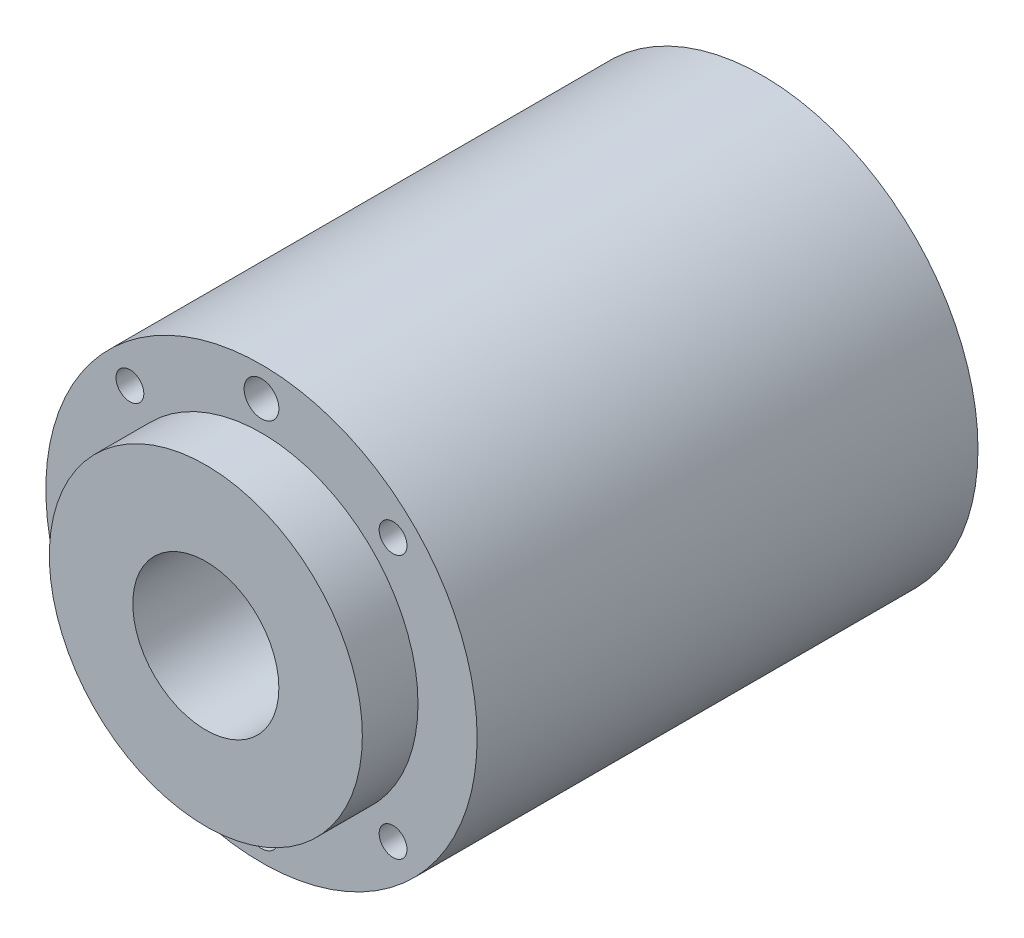
ISO-10303-21;
HEADER;
FILE_DESCRIPTION(('STEP AP214'),'2;1');
FILE_NAME('part.step','',(''),(''),'','','');
FILE_SCHEMA(('AUTOMOTIVE_DESIGN { 1 0 10303 214 1 1 1 1 }'));
ENDSEC;
DATA;
#1=APPLICATION_CONTEXT('core data for automotive mechanical design processes');
#2=APPLICATION_PROTOCOL_DEFINITION('international standard','automotive_design',2000,#1);
#3=PRODUCT_CONTEXT('',#1,'mechanical');
#4=PRODUCT('Part','Part','',(#3));
#5=PRODUCT_RELATED_PRODUCT_CATEGORY('part','',(#4));
#6=PRODUCT_DEFINITION_FORMATION('','',#4);
#7=PRODUCT_DEFINITION_CONTEXT('part definition',#1,'design');
#8=PRODUCT_DEFINITION('design','',#6,#7);
#9=PRODUCT_DEFINITION_SHAPE('','',#8);
#10=(LENGTH_UNIT() NAMED_UNIT(*) SI_UNIT(.MILLI.,.METRE.));
#11=(NAMED_UNIT(*) PLANE_ANGLE_UNIT() SI_UNIT($,.RADIAN.));
#12=(NAMED_UNIT(*) SI_UNIT($,.STERADIAN.) SOLID_ANGLE_UNIT());
#13=UNCERTAINTY_MEASURE_WITH_UNIT(LENGTH_MEASURE(1.E-05),#10,'distance_accuracy_value','');
#14=(GEOMETRIC_REPRESENTATION_CONTEXT(3) GLOBAL_UNCERTAINTY_ASSIGNED_CONTEXT((#13)) GLOBAL_UNIT_ASSIGNED_CONTEXT((#10,
#11,#12)) REPRESENTATION_CONTEXT('',''));
#15=CARTESIAN_POINT('',(0.,0.,0.));
#16=DIRECTION('',(0.,0.,1.));
#17=DIRECTION('',(1.,0.,0.));
#18=AXIS2_PLACEMENT_3D('',#15,#16,#17);
#19=CARTESIAN_POINT('',(0.,0.,-72.));
#20=DIRECTION('',(0.,0.,1.));
#21=DIRECTION('',(1.,0.,0.));
#22=AXIS2_PLACEMENT_3D('',#19,#20,#21);
#23=CYLINDRICAL_SURFACE('',#22,31.);
#24=CARTESIAN_POINT('',(0.,0.,-72.));
#25=DIRECTION('',(0.,0.,1.));
#26=DIRECTION('',(1.,0.,0.));
#27=AXIS2_PLACEMENT_3D('',#24,#25,#26);
#28=CIRCLE('',#27,31.);
#29=CARTESIAN_POINT('',(31.,0.,-72.));
#30=VERTEX_POINT('',#29);
#31=EDGE_CURVE('E48',#30,#30,#28,.T.);
#32=ORIENTED_EDGE('',*,*,#31,.T.);
#33=EDGE_LOOP('',(#32));
#34=FACE_BOUND('',#33,.T.);
#35=CARTESIAN_POINT('',(0.,0.,0.));
#36=DIRECTION('',(0.,0.,1.));
#37=DIRECTION('',(1.,0.,0.));
#38=AXIS2_PLACEMENT_3D('',#35,#36,#37);
#39=CIRCLE('',#38,31.);
#40=CARTESIAN_POINT('',(31.,0.,0.));
#41=VERTEX_POINT('',#40);
#42=EDGE_CURVE('E39',#41,#41,#39,.T.);
#43=ORIENTED_EDGE('',*,*,#42,.F.);
#44=EDGE_LOOP('',(#43));
#45=FACE_BOUND('',#44,.T.);
#46=ADVANCED_FACE('F36',(#34,#45),#23,.T.);
#47=CARTESIAN_POINT('',(0.,0.,-72.));
#48=DIRECTION('',(0.,0.,1.));
#49=DIRECTION('',(1.,0.,0.));
#50=AXIS2_PLACEMENT_3D('',#47,#48,#49);
#51=CYLINDRICAL_SURFACE('',#50,10.5);
#52=CARTESIAN_POINT('',(0.,0.,-72.));
#53=DIRECTION('',(0.,0.,1.));
#54=DIRECTION('',(1.,0.,0.));
#55=AXIS2_PLACEMENT_3D('',#52,#53,#54);
#56=CIRCLE('',#55,10.5);
#57=CARTESIAN_POINT('',(10.5,0.,-72.));
#58=VERTEX_POINT('',#57);
#59=EDGE_CURVE('E43',#58,#58,#56,.T.);
#60=ORIENTED_EDGE('',*,*,#59,.F.);
#61=EDGE_LOOP('',(#60));
#62=FACE_BOUND('',#61,.T.);
#63=CARTESIAN_POINT('',(0.,0.,8.));
#64=DIRECTION('',(0.,0.,1.));
#65=DIRECTION('',(1.,0.,0.));
#66=AXIS2_PLACEMENT_3D('',#63,#64,#65);
#67=CIRCLE('',#66,10.5);
#68=CARTESIAN_POINT('',(10.5,0.,8.));
#69=VERTEX_POINT('',#68);
#70=EDGE_CURVE('E60',#69,#69,#67,.T.);
#71=ORIENTED_EDGE('',*,*,#70,.T.);
#72=EDGE_LOOP('',(#71));
#73=FACE_BOUND('',#72,.T.);
#74=ADVANCED_FACE('F141',(#62,#73),#51,.F.);
#75=CARTESIAN_POINT('',(0.,0.,-72.));
#76=DIRECTION('',(0.,0.,1.));
#77=DIRECTION('',(1.,0.,0.));
#78=AXIS2_PLACEMENT_3D('',#75,#76,#77);
#79=PLANE('',#78);
#80=ORIENTED_EDGE('',*,*,#31,.F.);
#81=EDGE_LOOP('',(#80));
#82=FACE_BOUND('',#81,.T.);
#83=ORIENTED_EDGE('',*,*,#59,.T.);
#84=EDGE_LOOP('',(#83));
#85=FACE_BOUND('',#84,.T.);
#86=ADVANCED_FACE('F110',(#82,#85),#79,.F.);
#87=CARTESIAN_POINT('',(0.,0.,0.));
#88=DIRECTION('',(0.,0.,1.));
#89=DIRECTION('',(1.,0.,0.));
#90=AXIS2_PLACEMENT_3D('',#87,#88,#89);
#91=PLANE('',#90);
#92=CARTESIAN_POINT('',(0.,26.75,0.));
#93=DIRECTION('',(0.,0.,1.));
#94=DIRECTION('',(1.,0.,0.));
#95=AXIS2_PLACEMENT_3D('',#92,#93,#94);
#96=CIRCLE('',#95,2.5);
#97=CARTESIAN_POINT('',(2.5,26.75,0.));
#98=VERTEX_POINT('',#97);
#99=EDGE_CURVE('E68',#98,#98,#96,.T.);
#100=ORIENTED_EDGE('',*,*,#99,.F.);
#101=EDGE_LOOP('',(#100));
#102=FACE_BOUND('',#101,.T.);
#103=CARTESIAN_POINT('',(-18.9151063967401,18.9151063967402,0.));
#104=DIRECTION('',(0.,0.,1.));
#105=DIRECTION('',(1.,0.,0.));
#106=AXIS2_PLACEMENT_3D('',#103,#104,#105);
#107=CIRCLE('',#106,2.00000000000001);
#108=CARTESIAN_POINT('',(-16.91510639674,18.9151063967402,0.));
#109=VERTEX_POINT('',#108);
#110=EDGE_CURVE('E96',#109,#109,#107,.T.);
#111=ORIENTED_EDGE('',*,*,#110,.F.);
#112=EDGE_LOOP('',(#111));
#113=FACE_BOUND('',#112,.T.);
#114=CARTESIAN_POINT('',(18.9151063967402,18.91510639674,0.));
#115=DIRECTION('',(0.,0.,1.));
#116=DIRECTION('',(1.,0.,0.));
#117=AXIS2_PLACEMENT_3D('',#114,#115,#116);
#118=CIRCLE('',#117,2.00000000000001);
#119=CARTESIAN_POINT('',(20.9151063967402,18.91510639674,0.));
#120=VERTEX_POINT('',#119);
#121=EDGE_CURVE('E78',#120,#120,#118,.T.);
#122=ORIENTED_EDGE('',*,*,#121,.F.);
#123=EDGE_LOOP('',(#122));
#124=FACE_BOUND('',#123,.T.);
#125=CARTESIAN_POINT('',(0.,-26.75,0.));
#126=DIRECTION('',(0.,0.,1.));
#127=DIRECTION('',(-1.,0.,0.));
#128=AXIS2_PLACEMENT_3D('',#125,#126,#127);
#129=CIRCLE('',#128,2.5);
#130=CARTESIAN_POINT('',(-2.5,-26.75,0.));
#131=VERTEX_POINT('',#130);
#132=EDGE_CURVE('E71',#131,#131,#129,.T.);
#133=ORIENTED_EDGE('',*,*,#132,.F.);
#134=EDGE_LOOP('',(#133));
#135=FACE_BOUND('',#134,.T.);
#136=CARTESIAN_POINT('',(18.9151063967401,-18.9151063967402,0.));
#137=DIRECTION('',(0.,0.,1.));
#138=DIRECTION('',(1.,0.,0.));
#139=AXIS2_PLACEMENT_3D('',#136,#137,#138);
#140=CIRCLE('',#139,2.00000000000001);
#141=CARTESIAN_POINT('',(20.9151063967401,-18.9151063967402,0.));
#142=VERTEX_POINT('',#141);
#143=EDGE_CURVE('E91',#142,#142,#140,.T.);
#144=ORIENTED_EDGE('',*,*,#143,.F.);
#145=EDGE_LOOP('',(#144));
#146=FACE_BOUND('',#145,.T.);
#147=CARTESIAN_POINT('',(-18.9151063967402,-18.9151063967401,0.));
#148=DIRECTION('',(0.,0.,1.));
#149=DIRECTION('',(1.,0.,0.));
#150=AXIS2_PLACEMENT_3D('',#147,#148,#149);
#151=CIRCLE('',#150,2.00000000000001);
#152=CARTESIAN_POINT('',(-16.9151063967402,-18.9151063967401,0.));
#153=VERTEX_POINT('',#152);
#154=EDGE_CURVE('E84',#153,#153,#151,.T.);
#155=ORIENTED_EDGE('',*,*,#154,.F.);
#156=EDGE_LOOP('',(#155));
#157=FACE_BOUND('',#156,.T.);
#158=CARTESIAN_POINT('',(0.,0.,0.));
#159=DIRECTION('',(0.,0.,1.));
#160=DIRECTION('',(1.,0.,0.));
#161=AXIS2_PLACEMENT_3D('',#158,#159,#160);
#162=CIRCLE('',#161,22.5);
#163=CARTESIAN_POINT('',(22.5,0.,0.));
#164=VERTEX_POINT('',#163);
#165=EDGE_CURVE('E10',#164,#164,#162,.T.);
#166=ORIENTED_EDGE('',*,*,#165,.F.);
#167=EDGE_LOOP('',(#166));
#168=FACE_BOUND('',#167,.T.);
#169=ORIENTED_EDGE('',*,*,#42,.T.);
#170=EDGE_LOOP('',(#169));
#171=FACE_BOUND('',#170,.T.);
#172=ADVANCED_FACE('F106',(#102,#113,#124,#135,#146,#157,#168,#171),#91,.T.);
#173=CARTESIAN_POINT('',(0.,0.,8.));
#174=DIRECTION('',(0.,0.,-1.));
#175=DIRECTION('',(-1.,0.,0.));
#176=AXIS2_PLACEMENT_3D('',#173,#174,#175);
#177=CYLINDRICAL_SURFACE('',#176,22.5);
#178=CARTESIAN_POINT('',(0.,0.,8.));
#179=DIRECTION('',(0.,0.,1.));
#180=DIRECTION('',(1.,0.,0.));
#181=AXIS2_PLACEMENT_3D('',#178,#179,#180);
#182=CIRCLE('',#181,22.5);
#183=CARTESIAN_POINT('',(22.5,0.,8.));
#184=VERTEX_POINT('',#183);
#185=EDGE_CURVE('E51',#184,#184,#182,.T.);
#186=ORIENTED_EDGE('',*,*,#185,.F.);
#187=EDGE_LOOP('',(#186));
#188=FACE_BOUND('',#187,.T.);
#189=ORIENTED_EDGE('',*,*,#165,.T.);
#190=EDGE_LOOP('',(#189));
#191=FACE_BOUND('',#190,.T.);
#192=ADVANCED_FACE('F109',(#188,#191),#177,.T.);
#193=CARTESIAN_POINT('',(0.,0.,8.));
#194=DIRECTION('',(0.,0.,1.));
#195=DIRECTION('',(1.,0.,0.));
#196=AXIS2_PLACEMENT_3D('',#193,#194,#195);
#197=PLANE('',#196);
#198=ORIENTED_EDGE('',*,*,#70,.F.);
#199=EDGE_LOOP('',(#198));
#200=FACE_BOUND('',#199,.T.);
#201=ORIENTED_EDGE('',*,*,#185,.T.);
#202=EDGE_LOOP('',(#201));
#203=FACE_BOUND('',#202,.T.);
#204=ADVANCED_FACE('F126',(#200,#203),#197,.T.);
#205=CARTESIAN_POINT('',(-18.9151063967402,-18.9151063967401,-7.));
#206=DIRECTION('',(0.,0.,1.));
#207=DIRECTION('',(1.,0.,0.));
#208=AXIS2_PLACEMENT_3D('',#205,#206,#207);
#209=CYLINDRICAL_SURFACE('',#208,2.00000000000001);
#210=CARTESIAN_POINT('',(-18.9151063967402,-18.9151063967401,-7.));
#211=DIRECTION('',(0.,0.,1.));
#212=DIRECTION('',(1.,0.,0.));
#213=AXIS2_PLACEMENT_3D('',#210,#211,#212);
#214=CIRCLE('',#213,2.00000000000001);
#215=CARTESIAN_POINT('',(-16.9151063967402,-18.9151063967401,-7.));
#216=VERTEX_POINT('',#215);
#217=EDGE_CURVE('E87',#216,#216,#214,.T.);
#218=ORIENTED_EDGE('',*,*,#217,.F.);
#219=EDGE_LOOP('',(#218));
#220=FACE_BOUND('',#219,.T.);
#221=ORIENTED_EDGE('',*,*,#154,.T.);
#222=EDGE_LOOP('',(#221));
#223=FACE_BOUND('',#222,.T.);
#224=ADVANCED_FACE('F123',(#220,#223),#209,.F.);
#225=CARTESIAN_POINT('',(-18.9151063967402,-18.9151063967401,-7.));
#226=DIRECTION('',(0.,0.,1.));
#227=DIRECTION('',(1.,0.,0.));
#228=AXIS2_PLACEMENT_3D('',#225,#226,#227);
#229=PLANE('',#228);
#230=ORIENTED_EDGE('',*,*,#217,.T.);
#231=EDGE_LOOP('',(#230));
#232=FACE_BOUND('',#231,.T.);
#233=ADVANCED_FACE('F125',(#232),#229,.T.);
#234=CARTESIAN_POINT('',(18.9151063967401,-18.9151063967402,-7.));
#235=DIRECTION('',(0.,0.,1.));
#236=DIRECTION('',(1.,0.,0.));
#237=AXIS2_PLACEMENT_3D('',#234,#235,#236);
#238=CYLINDRICAL_SURFACE('',#237,2.00000000000001);
#239=CARTESIAN_POINT('',(18.9151063967401,-18.9151063967402,-7.));
#240=DIRECTION('',(0.,0.,1.));
#241=DIRECTION('',(1.,0.,0.));
#242=AXIS2_PLACEMENT_3D('',#239,#240,#241);
#243=CIRCLE('',#242,2.00000000000001);
#244=CARTESIAN_POINT('',(20.9151063967401,-18.9151063967402,-7.));
#245=VERTEX_POINT('',#244);
#246=EDGE_CURVE('E75',#245,#245,#243,.T.);
#247=ORIENTED_EDGE('',*,*,#246,.F.);
#248=EDGE_LOOP('',(#247));
#249=FACE_BOUND('',#248,.T.);
#250=ORIENTED_EDGE('',*,*,#143,.T.);
#251=EDGE_LOOP('',(#250));
#252=FACE_BOUND('',#251,.T.);
#253=ADVANCED_FACE('F133',(#249,#252),#238,.F.);
#254=CARTESIAN_POINT('',(18.9151063967401,-18.9151063967402,-7.));
#255=DIRECTION('',(0.,0.,1.));
#256=DIRECTION('',(1.,0.,0.));
#257=AXIS2_PLACEMENT_3D('',#254,#255,#256);
#258=PLANE('',#257);
#259=ORIENTED_EDGE('',*,*,#246,.T.);
#260=EDGE_LOOP('',(#259));
#261=FACE_BOUND('',#260,.T.);
#262=ADVANCED_FACE('F161',(#261),#258,.T.);
#263=CARTESIAN_POINT('',(0.,-26.75,-7.));
#264=DIRECTION('',(0.,0.,1.));
#265=DIRECTION('',(1.,0.,0.));
#266=AXIS2_PLACEMENT_3D('',#263,#264,#265);
#267=CYLINDRICAL_SURFACE('',#266,2.5);
#268=CARTESIAN_POINT('',(0.,-26.75,-7.));
#269=DIRECTION('',(0.,0.,1.));
#270=DIRECTION('',(-1.,0.,0.));
#271=AXIS2_PLACEMENT_3D('',#268,#269,#270);
#272=CIRCLE('',#271,2.5);
#273=CARTESIAN_POINT('',(-2.5,-26.75,-7.));
#274=VERTEX_POINT('',#273);
#275=EDGE_CURVE('E74',#274,#274,#272,.T.);
#276=ORIENTED_EDGE('',*,*,#275,.F.);
#277=EDGE_LOOP('',(#276));
#278=FACE_BOUND('',#277,.T.);
#279=ORIENTED_EDGE('',*,*,#132,.T.);
#280=EDGE_LOOP('',(#279));
#281=FACE_BOUND('',#280,.T.);
#282=ADVANCED_FACE('F157',(#278,#281),#267,.F.);
#283=CARTESIAN_POINT('',(0.,-26.75,-7.));
#284=DIRECTION('',(0.,0.,-1.));
#285=DIRECTION('',(-1.,0.,0.));
#286=AXIS2_PLACEMENT_3D('',#283,#284,#285);
#287=PLANE('',#286);
#288=ORIENTED_EDGE('',*,*,#275,.T.);
#289=EDGE_LOOP('',(#288));
#290=FACE_BOUND('',#289,.T.);
#291=ADVANCED_FACE('F160',(#290),#287,.F.);
#292=CARTESIAN_POINT('',(18.9151063967402,18.91510639674,-7.));
#293=DIRECTION('',(0.,0.,1.));
#294=DIRECTION('',(1.,0.,0.));
#295=AXIS2_PLACEMENT_3D('',#292,#293,#294);
#296=CYLINDRICAL_SURFACE('',#295,2.00000000000001);
#297=CARTESIAN_POINT('',(18.9151063967402,18.91510639674,-7.));
#298=DIRECTION('',(0.,0.,1.));
#299=DIRECTION('',(1.,0.,0.));
#300=AXIS2_PLACEMENT_3D('',#297,#298,#299);
#301=CIRCLE('',#300,2.00000000000001);
#302=CARTESIAN_POINT('',(20.9151063967402,18.91510639674,-7.));
#303=VERTEX_POINT('',#302);
#304=EDGE_CURVE('E81',#303,#303,#301,.T.);
#305=ORIENTED_EDGE('',*,*,#304,.F.);
#306=EDGE_LOOP('',(#305));
#307=FACE_BOUND('',#306,.T.);
#308=ORIENTED_EDGE('',*,*,#121,.T.);
#309=EDGE_LOOP('',(#308));
#310=FACE_BOUND('',#309,.T.);
#311=ADVANCED_FACE('F165',(#307,#310),#296,.F.);
#312=CARTESIAN_POINT('',(18.9151063967402,18.91510639674,-7.));
#313=DIRECTION('',(0.,0.,1.));
#314=DIRECTION('',(1.,0.,0.));
#315=AXIS2_PLACEMENT_3D('',#312,#313,#314);
#316=PLANE('',#315);
#317=ORIENTED_EDGE('',*,*,#304,.T.);
#318=EDGE_LOOP('',(#317));
#319=FACE_BOUND('',#318,.T.);
#320=ADVANCED_FACE('F168',(#319),#316,.T.);
#321=CARTESIAN_POINT('',(-18.9151063967401,18.9151063967402,-7.));
#322=DIRECTION('',(0.,0.,1.));
#323=DIRECTION('',(1.,0.,0.));
#324=AXIS2_PLACEMENT_3D('',#321,#322,#323);
#325=CYLINDRICAL_SURFACE('',#324,2.00000000000001);
#326=CARTESIAN_POINT('',(-18.9151063967401,18.9151063967402,-7.));
#327=DIRECTION('',(0.,0.,1.));
#328=DIRECTION('',(1.,0.,0.));
#329=AXIS2_PLACEMENT_3D('',#326,#327,#328);
#330=CIRCLE('',#329,2.00000000000001);
#331=CARTESIAN_POINT('',(-16.91510639674,18.9151063967402,-7.));
#332=VERTEX_POINT('',#331);
#333=EDGE_CURVE('E88',#332,#332,#330,.T.);
#334=ORIENTED_EDGE('',*,*,#333,.F.);
#335=EDGE_LOOP('',(#334));
#336=FACE_BOUND('',#335,.T.);
#337=ORIENTED_EDGE('',*,*,#110,.T.);
#338=EDGE_LOOP('',(#337));
#339=FACE_BOUND('',#338,.T.);
#340=ADVANCED_FACE('F171',(#336,#339),#325,.F.);
#341=CARTESIAN_POINT('',(-18.9151063967401,18.9151063967402,-7.));
#342=DIRECTION('',(0.,0.,1.));
#343=DIRECTION('',(1.,0.,0.));
#344=AXIS2_PLACEMENT_3D('',#341,#342,#343);
#345=PLANE('',#344);
#346=ORIENTED_EDGE('',*,*,#333,.T.);
#347=EDGE_LOOP('',(#346));
#348=FACE_BOUND('',#347,.T.);
#349=ADVANCED_FACE('F176',(#348),#345,.T.);
#350=CARTESIAN_POINT('',(0.,26.75,-7.));
#351=DIRECTION('',(0.,0.,1.));
#352=DIRECTION('',(1.,0.,0.));
#353=AXIS2_PLACEMENT_3D('',#350,#351,#352);
#354=CYLINDRICAL_SURFACE('',#353,2.5);
#355=CARTESIAN_POINT('',(0.,26.75,-7.));
#356=DIRECTION('',(0.,0.,1.));
#357=DIRECTION('',(1.,0.,0.));
#358=AXIS2_PLACEMENT_3D('',#355,#356,#357);
#359=CIRCLE('',#358,2.5);
#360=CARTESIAN_POINT('',(2.5,26.75,-7.));
#361=VERTEX_POINT('',#360);
#362=EDGE_CURVE('E64',#361,#361,#359,.T.);
#363=ORIENTED_EDGE('',*,*,#362,.F.);
#364=EDGE_LOOP('',(#363));
#365=FACE_BOUND('',#364,.T.);
#366=ORIENTED_EDGE('',*,*,#99,.T.);
#367=EDGE_LOOP('',(#366));
#368=FACE_BOUND('',#367,.T.);
#369=ADVANCED_FACE('F104',(#365,#368),#354,.F.);
#370=CARTESIAN_POINT('',(0.,26.75,-7.));
#371=DIRECTION('',(0.,0.,1.));
#372=DIRECTION('',(1.,0.,0.));
#373=AXIS2_PLACEMENT_3D('',#370,#371,#372);
#374=PLANE('',#373);
#375=ORIENTED_EDGE('',*,*,#362,.T.);
#376=EDGE_LOOP('',(#375));
#377=FACE_BOUND('',#376,.T.);
#378=ADVANCED_FACE('F244',(#377),#374,.T.);
#379=CLOSED_SHELL('',(#46,#74,#86,#172,#192,#204,#224,#233,#253,#262,#282,#291,#311,#320,#340,
#349,#369,#378));
#380=MANIFOLD_SOLID_BREP('B2',#379);
#381=ADVANCED_BREP_SHAPE_REPRESENTATION('',(#18,#380),#14);
#382=SHAPE_DEFINITION_REPRESENTATION(#9,#381);
ENDSEC;
END-ISO-10303-21;
